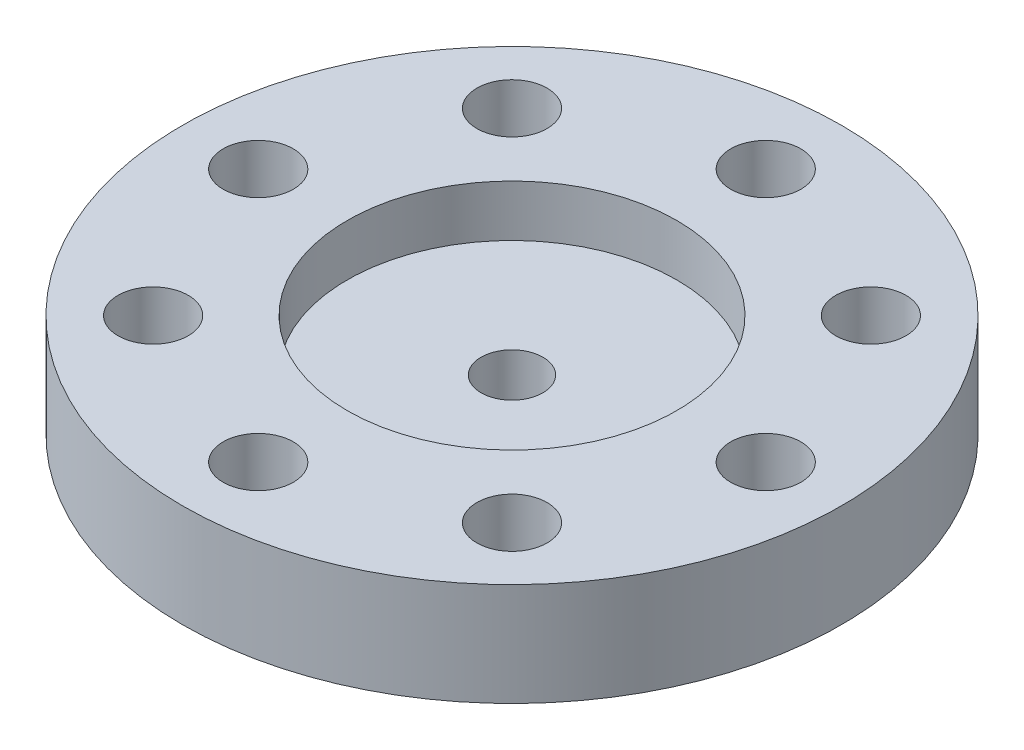
ISO-10303-21;
HEADER;
FILE_DESCRIPTION(('STEP AP214'),'2;1');
FILE_NAME('part.step','',(''),(''),'','','');
FILE_SCHEMA(('AUTOMOTIVE_DESIGN { 1 0 10303 214 1 1 1 1 }'));
ENDSEC;
DATA;
#1=APPLICATION_CONTEXT('core data for automotive mechanical design processes');
#2=APPLICATION_PROTOCOL_DEFINITION('international standard','automotive_design',2000,#1);
#3=PRODUCT_CONTEXT('',#1,'mechanical');
#4=PRODUCT('Part','Part','',(#3));
#5=PRODUCT_RELATED_PRODUCT_CATEGORY('part','',(#4));
#6=PRODUCT_DEFINITION_FORMATION('','',#4);
#7=PRODUCT_DEFINITION_CONTEXT('part definition',#1,'design');
#8=PRODUCT_DEFINITION('design','',#6,#7);
#9=PRODUCT_DEFINITION_SHAPE('','',#8);
#10=(LENGTH_UNIT() NAMED_UNIT(*) SI_UNIT(.MILLI.,.METRE.));
#11=(NAMED_UNIT(*) PLANE_ANGLE_UNIT() SI_UNIT($,.RADIAN.));
#12=(NAMED_UNIT(*) SI_UNIT($,.STERADIAN.) SOLID_ANGLE_UNIT());
#13=UNCERTAINTY_MEASURE_WITH_UNIT(LENGTH_MEASURE(1.E-05),#10,'distance_accuracy_value','');
#14=(GEOMETRIC_REPRESENTATION_CONTEXT(3) GLOBAL_UNCERTAINTY_ASSIGNED_CONTEXT((#13)) GLOBAL_UNIT_ASSIGNED_CONTEXT((#10,
#11,#12)) REPRESENTATION_CONTEXT('',''));
#15=CARTESIAN_POINT('',(0.,0.,0.));
#16=DIRECTION('',(0.,0.,1.));
#17=DIRECTION('',(1.,0.,0.));
#18=AXIS2_PLACEMENT_3D('',#15,#16,#17);
#19=CARTESIAN_POINT('',(-6.35,4.7625,0.));
#20=DIRECTION('',(0.,-1.,0.));
#21=DIRECTION('',(0.,0.,-1.));
#22=AXIS2_PLACEMENT_3D('',#19,#20,#21);
#23=PLANE('',#22);
#24=CARTESIAN_POINT('',(6.91479721322333,4.7625,-6.91479721322316));
#25=DIRECTION('',(0.,1.,0.));
#26=DIRECTION('',(0.,0.,1.));
#27=AXIS2_PLACEMENT_3D('',#24,#25,#26);
#28=CIRCLE('',#27,1.35254999999999);
#29=CARTESIAN_POINT('',(6.91479721322333,4.7625,-5.56224721322318));
#30=VERTEX_POINT('',#29);
#31=EDGE_CURVE('E101',#30,#30,#28,.T.);
#32=ORIENTED_EDGE('',*,*,#31,.F.);
#33=EDGE_LOOP('',(#32));
#34=FACE_BOUND('',#33,.T.);
#35=CARTESIAN_POINT('',(1.02429588037641E-13,4.7625,-9.779));
#36=DIRECTION('',(0.,1.,0.));
#37=DIRECTION('',(0.,0.,1.));
#38=AXIS2_PLACEMENT_3D('',#35,#36,#37);
#39=CIRCLE('',#38,1.35254999999999);
#40=CARTESIAN_POINT('',(1.02429588037641E-13,4.7625,-8.42645000000001));
#41=VERTEX_POINT('',#40);
#42=EDGE_CURVE('E95',#41,#41,#39,.T.);
#43=ORIENTED_EDGE('',*,*,#42,.F.);
#44=EDGE_LOOP('',(#43));
#45=FACE_BOUND('',#44,.T.);
#46=CARTESIAN_POINT('',(-6.91479721322319,4.7625,-6.91479721322331));
#47=DIRECTION('',(0.,1.,0.));
#48=DIRECTION('',(0.,0.,1.));
#49=AXIS2_PLACEMENT_3D('',#46,#47,#48);
#50=CIRCLE('',#49,1.35254999999999);
#51=CARTESIAN_POINT('',(-6.91479721322319,4.7625,-5.56224721322332));
#52=VERTEX_POINT('',#51);
#53=EDGE_CURVE('E89',#52,#52,#50,.T.);
#54=ORIENTED_EDGE('',*,*,#53,.F.);
#55=EDGE_LOOP('',(#54));
#56=FACE_BOUND('',#55,.T.);
#57=CARTESIAN_POINT('',(-9.779,4.7625,0.));
#58=DIRECTION('',(0.,1.,0.));
#59=DIRECTION('',(0.,0.,1.));
#60=AXIS2_PLACEMENT_3D('',#57,#58,#59);
#61=CIRCLE('',#60,1.35254999999999);
#62=CARTESIAN_POINT('',(-9.779,4.7625,1.35254999999999));
#63=VERTEX_POINT('',#62);
#64=EDGE_CURVE('E83',#63,#63,#61,.T.);
#65=ORIENTED_EDGE('',*,*,#64,.F.);
#66=EDGE_LOOP('',(#65));
#67=FACE_BOUND('',#66,.T.);
#68=CARTESIAN_POINT('',(-6.91479721322328,4.7625,6.91479721322321));
#69=DIRECTION('',(0.,1.,0.));
#70=DIRECTION('',(0.,0.,1.));
#71=AXIS2_PLACEMENT_3D('',#68,#69,#70);
#72=CIRCLE('',#71,1.35254999999999);
#73=CARTESIAN_POINT('',(-6.91479721322328,4.7625,8.2673472132232));
#74=VERTEX_POINT('',#73);
#75=EDGE_CURVE('E77',#74,#74,#72,.T.);
#76=ORIENTED_EDGE('',*,*,#75,.F.);
#77=EDGE_LOOP('',(#76));
#78=FACE_BOUND('',#77,.T.);
#79=CARTESIAN_POINT('',(0.,4.7625,9.779));
#80=DIRECTION('',(0.,1.,0.));
#81=DIRECTION('',(0.,0.,1.));
#82=AXIS2_PLACEMENT_3D('',#79,#80,#81);
#83=CIRCLE('',#82,1.35254999999999);
#84=CARTESIAN_POINT('',(0.,4.7625,11.13155));
#85=VERTEX_POINT('',#84);
#86=EDGE_CURVE('E71',#85,#85,#83,.T.);
#87=ORIENTED_EDGE('',*,*,#86,.F.);
#88=EDGE_LOOP('',(#87));
#89=FACE_BOUND('',#88,.T.);
#90=CARTESIAN_POINT('',(6.91479721322324,4.7625,6.91479721322326));
#91=DIRECTION('',(0.,1.,0.));
#92=DIRECTION('',(0.,0.,1.));
#93=AXIS2_PLACEMENT_3D('',#90,#91,#92);
#94=CIRCLE('',#93,1.35254999999999);
#95=CARTESIAN_POINT('',(6.91479721322324,4.7625,8.26734721322325));
#96=VERTEX_POINT('',#95);
#97=EDGE_CURVE('E65',#96,#96,#94,.T.);
#98=ORIENTED_EDGE('',*,*,#97,.F.);
#99=EDGE_LOOP('',(#98));
#100=FACE_BOUND('',#99,.T.);
#101=CARTESIAN_POINT('',(9.779,4.7625,0.));
#102=DIRECTION('',(0.,1.,0.));
#103=DIRECTION('',(0.,0.,1.));
#104=AXIS2_PLACEMENT_3D('',#101,#102,#103);
#105=CIRCLE('',#104,1.35254999999999);
#106=CARTESIAN_POINT('',(9.779,4.7625,1.35254999999999));
#107=VERTEX_POINT('',#106);
#108=EDGE_CURVE('E59',#107,#107,#105,.T.);
#109=ORIENTED_EDGE('',*,*,#108,.F.);
#110=EDGE_LOOP('',(#109));
#111=FACE_BOUND('',#110,.T.);
#112=CARTESIAN_POINT('',(0.,4.7625,0.));
#113=DIRECTION('',(0.,-1.,0.));
#114=DIRECTION('',(0.,0.,-1.));
#115=AXIS2_PLACEMENT_3D('',#112,#113,#114);
#116=CIRCLE('',#115,12.7);
#117=CARTESIAN_POINT('',(0.,4.7625,-12.7));
#118=VERTEX_POINT('',#117);
#119=EDGE_CURVE('E10',#118,#118,#116,.T.);
#120=ORIENTED_EDGE('',*,*,#119,.F.);
#121=EDGE_LOOP('',(#120));
#122=FACE_BOUND('',#121,.T.);
#123=CARTESIAN_POINT('',(0.,4.7625,0.));
#124=DIRECTION('',(0.,-1.,0.));
#125=DIRECTION('',(0.,0.,-1.));
#126=AXIS2_PLACEMENT_3D('',#123,#124,#125);
#127=CIRCLE('',#126,6.35);
#128=CARTESIAN_POINT('',(0.,4.7625,-6.35));
#129=VERTEX_POINT('',#128);
#130=EDGE_CURVE('E53',#129,#129,#127,.T.);
#131=ORIENTED_EDGE('',*,*,#130,.T.);
#132=EDGE_LOOP('',(#131));
#133=FACE_BOUND('',#132,.T.);
#134=ADVANCED_FACE('F31',(#34,#45,#56,#67,#78,#89,#100,#111,#122,#133),#23,.F.);
#135=CARTESIAN_POINT('',(0.,0.,0.));
#136=DIRECTION('',(0.,-1.,0.));
#137=DIRECTION('',(0.,0.,-1.));
#138=AXIS2_PLACEMENT_3D('',#135,#136,#137);
#139=CYLINDRICAL_SURFACE('',#138,12.7);
#140=CARTESIAN_POINT('',(0.,0.79375,0.));
#141=DIRECTION('',(0.,-1.,0.));
#142=DIRECTION('',(0.,0.,-1.));
#143=AXIS2_PLACEMENT_3D('',#140,#141,#142);
#144=CIRCLE('',#143,12.7);
#145=CARTESIAN_POINT('',(0.,0.79375,-12.7));
#146=VERTEX_POINT('',#145);
#147=EDGE_CURVE('E37',#146,#146,#144,.T.);
#148=ORIENTED_EDGE('',*,*,#147,.F.);
#149=EDGE_LOOP('',(#148));
#150=FACE_BOUND('',#149,.T.);
#151=ORIENTED_EDGE('',*,*,#119,.T.);
#152=EDGE_LOOP('',(#151));
#153=FACE_BOUND('',#152,.T.);
#154=ADVANCED_FACE('F109',(#150,#153),#139,.T.);
#155=CARTESIAN_POINT('',(-12.7,0.79375,0.));
#156=DIRECTION('',(0.,1.,0.));
#157=DIRECTION('',(0.,0.,1.));
#158=AXIS2_PLACEMENT_3D('',#155,#156,#157);
#159=PLANE('',#158);
#160=CARTESIAN_POINT('',(6.91479721322333,0.79375,-6.91479721322316));
#161=DIRECTION('',(0.,1.,0.));
#162=DIRECTION('',(0.,0.,1.));
#163=AXIS2_PLACEMENT_3D('',#160,#161,#162);
#164=CIRCLE('',#163,1.35255);
#165=CARTESIAN_POINT('',(6.91479721322333,0.79375,-5.56224721322317));
#166=VERTEX_POINT('',#165);
#167=EDGE_CURVE('E98',#166,#166,#164,.T.);
#168=ORIENTED_EDGE('',*,*,#167,.T.);
#169=EDGE_LOOP('',(#168));
#170=FACE_BOUND('',#169,.T.);
#171=CARTESIAN_POINT('',(1.02429588037641E-13,0.79375,-9.779));
#172=DIRECTION('',(0.,1.,0.));
#173=DIRECTION('',(0.,0.,1.));
#174=AXIS2_PLACEMENT_3D('',#171,#172,#173);
#175=CIRCLE('',#174,1.35255);
#176=CARTESIAN_POINT('',(1.02429588037641E-13,0.79375,-8.42645));
#177=VERTEX_POINT('',#176);
#178=EDGE_CURVE('E92',#177,#177,#175,.T.);
#179=ORIENTED_EDGE('',*,*,#178,.T.);
#180=EDGE_LOOP('',(#179));
#181=FACE_BOUND('',#180,.T.);
#182=CARTESIAN_POINT('',(-6.91479721322319,0.79375,-6.91479721322331));
#183=DIRECTION('',(0.,1.,0.));
#184=DIRECTION('',(0.,0.,1.));
#185=AXIS2_PLACEMENT_3D('',#182,#183,#184);
#186=CIRCLE('',#185,1.35255);
#187=CARTESIAN_POINT('',(-6.91479721322319,0.79375,-5.56224721322331));
#188=VERTEX_POINT('',#187);
#189=EDGE_CURVE('E86',#188,#188,#186,.T.);
#190=ORIENTED_EDGE('',*,*,#189,.T.);
#191=EDGE_LOOP('',(#190));
#192=FACE_BOUND('',#191,.T.);
#193=CARTESIAN_POINT('',(-9.779,0.79375,0.));
#194=DIRECTION('',(0.,1.,0.));
#195=DIRECTION('',(0.,0.,1.));
#196=AXIS2_PLACEMENT_3D('',#193,#194,#195);
#197=CIRCLE('',#196,1.35255);
#198=CARTESIAN_POINT('',(-9.779,0.79375,1.35255));
#199=VERTEX_POINT('',#198);
#200=EDGE_CURVE('E80',#199,#199,#197,.T.);
#201=ORIENTED_EDGE('',*,*,#200,.T.);
#202=EDGE_LOOP('',(#201));
#203=FACE_BOUND('',#202,.T.);
#204=CARTESIAN_POINT('',(-6.91479721322328,0.79375,6.91479721322321));
#205=DIRECTION('',(0.,1.,0.));
#206=DIRECTION('',(0.,0.,1.));
#207=AXIS2_PLACEMENT_3D('',#204,#205,#206);
#208=CIRCLE('',#207,1.35255);
#209=CARTESIAN_POINT('',(-6.91479721322328,0.79375,8.26734721322321));
#210=VERTEX_POINT('',#209);
#211=EDGE_CURVE('E74',#210,#210,#208,.T.);
#212=ORIENTED_EDGE('',*,*,#211,.T.);
#213=EDGE_LOOP('',(#212));
#214=FACE_BOUND('',#213,.T.);
#215=CARTESIAN_POINT('',(0.,0.79375,9.779));
#216=DIRECTION('',(0.,1.,0.));
#217=DIRECTION('',(0.,0.,1.));
#218=AXIS2_PLACEMENT_3D('',#215,#216,#217);
#219=CIRCLE('',#218,1.35255);
#220=CARTESIAN_POINT('',(0.,0.79375,11.13155));
#221=VERTEX_POINT('',#220);
#222=EDGE_CURVE('E68',#221,#221,#219,.T.);
#223=ORIENTED_EDGE('',*,*,#222,.T.);
#224=EDGE_LOOP('',(#223));
#225=FACE_BOUND('',#224,.T.);
#226=CARTESIAN_POINT('',(6.91479721322324,0.79375,6.91479721322326));
#227=DIRECTION('',(0.,1.,0.));
#228=DIRECTION('',(0.,0.,1.));
#229=AXIS2_PLACEMENT_3D('',#226,#227,#228);
#230=CIRCLE('',#229,1.35255);
#231=CARTESIAN_POINT('',(6.91479721322324,0.79375,8.26734721322326));
#232=VERTEX_POINT('',#231);
#233=EDGE_CURVE('E62',#232,#232,#230,.T.);
#234=ORIENTED_EDGE('',*,*,#233,.T.);
#235=EDGE_LOOP('',(#234));
#236=FACE_BOUND('',#235,.T.);
#237=CARTESIAN_POINT('',(9.779,0.79375,0.));
#238=DIRECTION('',(0.,1.,0.));
#239=DIRECTION('',(0.,0.,1.));
#240=AXIS2_PLACEMENT_3D('',#237,#238,#239);
#241=CIRCLE('',#240,1.35255);
#242=CARTESIAN_POINT('',(9.779,0.79375,1.35255));
#243=VERTEX_POINT('',#242);
#244=EDGE_CURVE('E56',#243,#243,#241,.T.);
#245=ORIENTED_EDGE('',*,*,#244,.T.);
#246=EDGE_LOOP('',(#245));
#247=FACE_BOUND('',#246,.T.);
#248=CARTESIAN_POINT('',(0.,0.79375,0.));
#249=DIRECTION('',(0.,-1.,0.));
#250=DIRECTION('',(0.,0.,-1.));
#251=AXIS2_PLACEMENT_3D('',#248,#249,#250);
#252=CIRCLE('',#251,1.190625);
#253=CARTESIAN_POINT('',(0.,0.79375,-1.190625));
#254=VERTEX_POINT('',#253);
#255=EDGE_CURVE('E41',#254,#254,#252,.T.);
#256=ORIENTED_EDGE('',*,*,#255,.F.);
#257=EDGE_LOOP('',(#256));
#258=FACE_BOUND('',#257,.T.);
#259=ORIENTED_EDGE('',*,*,#147,.T.);
#260=EDGE_LOOP('',(#259));
#261=FACE_BOUND('',#260,.T.);
#262=ADVANCED_FACE('F143',(#170,#181,#192,#203,#214,#225,#236,#247,#258,#261),#159,.F.);
#263=CARTESIAN_POINT('',(0.,0.,0.));
#264=DIRECTION('',(0.,-1.,0.));
#265=DIRECTION('',(0.,0.,-1.));
#266=AXIS2_PLACEMENT_3D('',#263,#264,#265);
#267=CYLINDRICAL_SURFACE('',#266,1.190625);
#268=CARTESIAN_POINT('',(0.,2.778125,0.));
#269=DIRECTION('',(0.,-1.,0.));
#270=DIRECTION('',(0.,0.,-1.));
#271=AXIS2_PLACEMENT_3D('',#268,#269,#270);
#272=CIRCLE('',#271,1.190625);
#273=CARTESIAN_POINT('',(0.,2.778125,-1.190625));
#274=VERTEX_POINT('',#273);
#275=EDGE_CURVE('E45',#274,#274,#272,.T.);
#276=ORIENTED_EDGE('',*,*,#275,.F.);
#277=EDGE_LOOP('',(#276));
#278=FACE_BOUND('',#277,.T.);
#279=ORIENTED_EDGE('',*,*,#255,.T.);
#280=EDGE_LOOP('',(#279));
#281=FACE_BOUND('',#280,.T.);
#282=ADVANCED_FACE('F137',(#278,#281),#267,.F.);
#283=CARTESIAN_POINT('',(-1.190625,2.778125,0.));
#284=DIRECTION('',(0.,-1.,0.));
#285=DIRECTION('',(0.,0.,-1.));
#286=AXIS2_PLACEMENT_3D('',#283,#284,#285);
#287=PLANE('',#286);
#288=CARTESIAN_POINT('',(0.,2.778125,0.));
#289=DIRECTION('',(0.,-1.,0.));
#290=DIRECTION('',(0.,0.,-1.));
#291=AXIS2_PLACEMENT_3D('',#288,#289,#290);
#292=CIRCLE('',#291,6.35);
#293=CARTESIAN_POINT('',(0.,2.778125,-6.35));
#294=VERTEX_POINT('',#293);
#295=EDGE_CURVE('E50',#294,#294,#292,.T.);
#296=ORIENTED_EDGE('',*,*,#295,.F.);
#297=EDGE_LOOP('',(#296));
#298=FACE_BOUND('',#297,.T.);
#299=ORIENTED_EDGE('',*,*,#275,.T.);
#300=EDGE_LOOP('',(#299));
#301=FACE_BOUND('',#300,.T.);
#302=ADVANCED_FACE('F131',(#298,#301),#287,.F.);
#303=CARTESIAN_POINT('',(0.,0.,0.));
#304=DIRECTION('',(0.,-1.,0.));
#305=DIRECTION('',(0.,0.,-1.));
#306=AXIS2_PLACEMENT_3D('',#303,#304,#305);
#307=CYLINDRICAL_SURFACE('',#306,6.35);
#308=ORIENTED_EDGE('',*,*,#130,.F.);
#309=EDGE_LOOP('',(#308));
#310=FACE_BOUND('',#309,.T.);
#311=ORIENTED_EDGE('',*,*,#295,.T.);
#312=EDGE_LOOP('',(#311));
#313=FACE_BOUND('',#312,.T.);
#314=ADVANCED_FACE('F127',(#310,#313),#307,.F.);
#315=CARTESIAN_POINT('',(9.779,4.7625,0.));
#316=DIRECTION('',(0.,1.,0.));
#317=DIRECTION('',(0.,0.,1.));
#318=AXIS2_PLACEMENT_3D('',#315,#316,#317);
#319=CYLINDRICAL_SURFACE('',#318,1.35254999999999);
#320=ORIENTED_EDGE('',*,*,#244,.F.);
#321=EDGE_LOOP('',(#320));
#322=FACE_BOUND('',#321,.T.);
#323=ORIENTED_EDGE('',*,*,#108,.T.);
#324=EDGE_LOOP('',(#323));
#325=FACE_BOUND('',#324,.T.);
#326=ADVANCED_FACE('F130',(#322,#325),#319,.F.);
#327=CARTESIAN_POINT('',(6.91479721322324,4.7625,6.91479721322326));
#328=DIRECTION('',(0.,1.,0.));
#329=DIRECTION('',(0.,0.,1.));
#330=AXIS2_PLACEMENT_3D('',#327,#328,#329);
#331=CYLINDRICAL_SURFACE('',#330,1.35254999999999);
#332=ORIENTED_EDGE('',*,*,#233,.F.);
#333=EDGE_LOOP('',(#332));
#334=FACE_BOUND('',#333,.T.);
#335=ORIENTED_EDGE('',*,*,#97,.T.);
#336=EDGE_LOOP('',(#335));
#337=FACE_BOUND('',#336,.T.);
#338=ADVANCED_FACE('F159',(#334,#337),#331,.F.);
#339=CARTESIAN_POINT('',(0.,4.7625,9.779));
#340=DIRECTION('',(0.,1.,0.));
#341=DIRECTION('',(0.,0.,1.));
#342=AXIS2_PLACEMENT_3D('',#339,#340,#341);
#343=CYLINDRICAL_SURFACE('',#342,1.35254999999999);
#344=ORIENTED_EDGE('',*,*,#222,.F.);
#345=EDGE_LOOP('',(#344));
#346=FACE_BOUND('',#345,.T.);
#347=ORIENTED_EDGE('',*,*,#86,.T.);
#348=EDGE_LOOP('',(#347));
#349=FACE_BOUND('',#348,.T.);
#350=ADVANCED_FACE('F163',(#346,#349),#343,.F.);
#351=CARTESIAN_POINT('',(-6.91479721322328,4.7625,6.91479721322321));
#352=DIRECTION('',(0.,1.,0.));
#353=DIRECTION('',(0.,0.,1.));
#354=AXIS2_PLACEMENT_3D('',#351,#352,#353);
#355=CYLINDRICAL_SURFACE('',#354,1.35254999999999);
#356=ORIENTED_EDGE('',*,*,#211,.F.);
#357=EDGE_LOOP('',(#356));
#358=FACE_BOUND('',#357,.T.);
#359=ORIENTED_EDGE('',*,*,#75,.T.);
#360=EDGE_LOOP('',(#359));
#361=FACE_BOUND('',#360,.T.);
#362=ADVANCED_FACE('F167',(#358,#361),#355,.F.);
#363=CARTESIAN_POINT('',(-9.779,4.7625,0.));
#364=DIRECTION('',(0.,1.,0.));
#365=DIRECTION('',(0.,0.,1.));
#366=AXIS2_PLACEMENT_3D('',#363,#364,#365);
#367=CYLINDRICAL_SURFACE('',#366,1.35254999999999);
#368=ORIENTED_EDGE('',*,*,#200,.F.);
#369=EDGE_LOOP('',(#368));
#370=FACE_BOUND('',#369,.T.);
#371=ORIENTED_EDGE('',*,*,#64,.T.);
#372=EDGE_LOOP('',(#371));
#373=FACE_BOUND('',#372,.T.);
#374=ADVANCED_FACE('F171',(#370,#373),#367,.F.);
#375=CARTESIAN_POINT('',(-6.91479721322319,4.7625,-6.91479721322331));
#376=DIRECTION('',(0.,1.,0.));
#377=DIRECTION('',(0.,0.,1.));
#378=AXIS2_PLACEMENT_3D('',#375,#376,#377);
#379=CYLINDRICAL_SURFACE('',#378,1.35254999999999);
#380=ORIENTED_EDGE('',*,*,#189,.F.);
#381=EDGE_LOOP('',(#380));
#382=FACE_BOUND('',#381,.T.);
#383=ORIENTED_EDGE('',*,*,#53,.T.);
#384=EDGE_LOOP('',(#383));
#385=FACE_BOUND('',#384,.T.);
#386=ADVANCED_FACE('F175',(#382,#385),#379,.F.);
#387=CARTESIAN_POINT('',(1.02429588037641E-13,4.7625,-9.779));
#388=DIRECTION('',(0.,1.,0.));
#389=DIRECTION('',(0.,0.,1.));
#390=AXIS2_PLACEMENT_3D('',#387,#388,#389);
#391=CYLINDRICAL_SURFACE('',#390,1.35254999999999);
#392=ORIENTED_EDGE('',*,*,#178,.F.);
#393=EDGE_LOOP('',(#392));
#394=FACE_BOUND('',#393,.T.);
#395=ORIENTED_EDGE('',*,*,#42,.T.);
#396=EDGE_LOOP('',(#395));
#397=FACE_BOUND('',#396,.T.);
#398=ADVANCED_FACE('F179',(#394,#397),#391,.F.);
#399=CARTESIAN_POINT('',(6.91479721322333,4.7625,-6.91479721322316));
#400=DIRECTION('',(0.,1.,0.));
#401=DIRECTION('',(0.,0.,1.));
#402=AXIS2_PLACEMENT_3D('',#399,#400,#401);
#403=CYLINDRICAL_SURFACE('',#402,1.35254999999999);
#404=ORIENTED_EDGE('',*,*,#167,.F.);
#405=EDGE_LOOP('',(#404));
#406=FACE_BOUND('',#405,.T.);
#407=ORIENTED_EDGE('',*,*,#31,.T.);
#408=EDGE_LOOP('',(#407));
#409=FACE_BOUND('',#408,.T.);
#410=ADVANCED_FACE('F105',(#406,#409),#403,.F.);
#411=CLOSED_SHELL('',(#134,#154,#262,#282,#302,#314,#326,#338,#350,#362,#374,#386,#398,#410));
#412=MANIFOLD_SOLID_BREP('B2',#411);
#413=ADVANCED_BREP_SHAPE_REPRESENTATION('',(#18,#412),#14);
#414=SHAPE_DEFINITION_REPRESENTATION(#9,#413);
ENDSEC;
END-ISO-10303-21;
